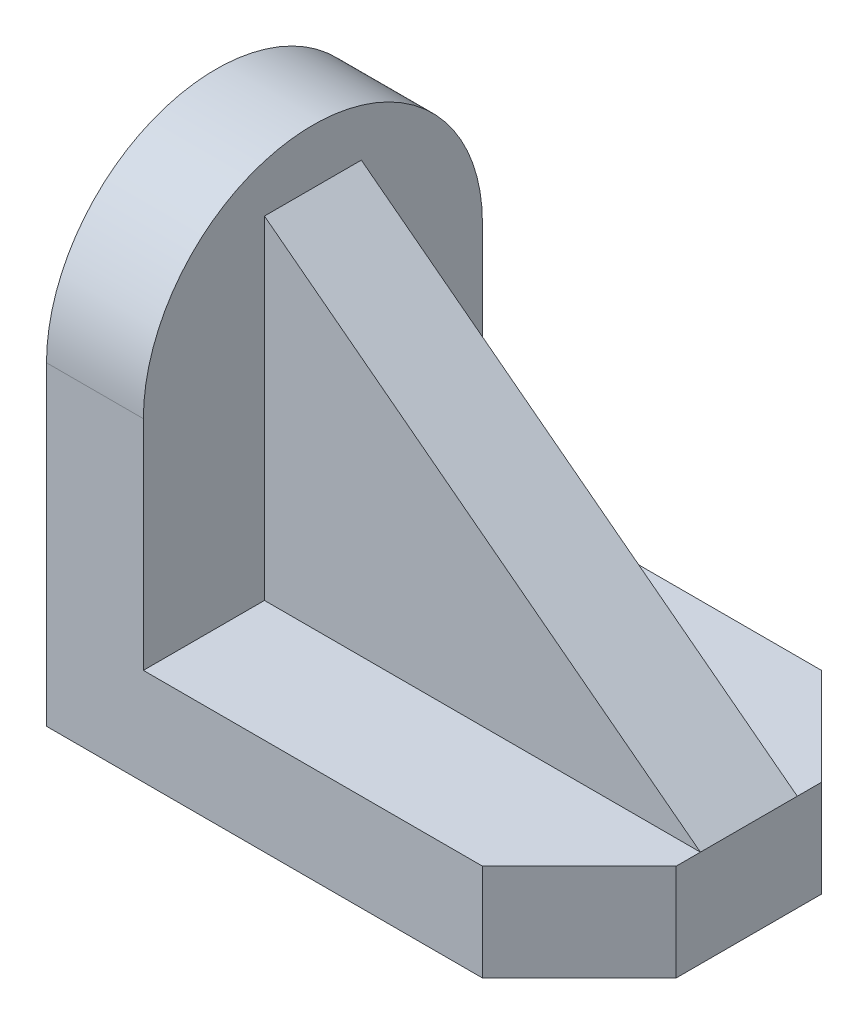
ISO-10303-21;
HEADER;
FILE_DESCRIPTION(('STEP AP214'),'2;1');
FILE_NAME('part.step','',(''),(''),'','','');
FILE_SCHEMA(('AUTOMOTIVE_DESIGN { 1 0 10303 214 1 1 1 1 }'));
ENDSEC;
DATA;
#1=APPLICATION_CONTEXT('core data for automotive mechanical design processes');
#2=APPLICATION_PROTOCOL_DEFINITION('international standard','automotive_design',2000,#1);
#3=PRODUCT_CONTEXT('',#1,'mechanical');
#4=PRODUCT('Part','Part','',(#3));
#5=PRODUCT_RELATED_PRODUCT_CATEGORY('part','',(#4));
#6=PRODUCT_DEFINITION_FORMATION('','',#4);
#7=PRODUCT_DEFINITION_CONTEXT('part definition',#1,'design');
#8=PRODUCT_DEFINITION('design','',#6,#7);
#9=PRODUCT_DEFINITION_SHAPE('','',#8);
#10=(LENGTH_UNIT() NAMED_UNIT(*) SI_UNIT(.MILLI.,.METRE.));
#11=(NAMED_UNIT(*) PLANE_ANGLE_UNIT() SI_UNIT($,.RADIAN.));
#12=(NAMED_UNIT(*) SI_UNIT($,.STERADIAN.) SOLID_ANGLE_UNIT());
#13=UNCERTAINTY_MEASURE_WITH_UNIT(LENGTH_MEASURE(1.E-05),#10,'distance_accuracy_value','');
#14=(GEOMETRIC_REPRESENTATION_CONTEXT(3) GLOBAL_UNCERTAINTY_ASSIGNED_CONTEXT((#13)) GLOBAL_UNIT_ASSIGNED_CONTEXT((#10,
#11,#12)) REPRESENTATION_CONTEXT('',''));
#15=CARTESIAN_POINT('',(0.,0.,0.));
#16=DIRECTION('',(0.,0.,1.));
#17=DIRECTION('',(1.,0.,0.));
#18=AXIS2_PLACEMENT_3D('',#15,#16,#17);
#19=CARTESIAN_POINT('',(0.,12.,0.));
#20=DIRECTION('',(0.,-1.,0.));
#21=DIRECTION('',(0.,0.,-1.));
#22=AXIS2_PLACEMENT_3D('',#19,#20,#21);
#23=PLANE('',#22);
#24=DIRECTION('',(0.,0.,-1.));
#25=VECTOR('',#24,1.);
#26=CARTESIAN_POINT('',(-21.,12.,21.));
#27=LINE('',#26,#25);
#28=CARTESIAN_POINT('',(-21.,12.,21.));
#29=VERTEX_POINT('',#28);
#30=CARTESIAN_POINT('',(-21.,12.,6.00000000000001));
#31=VERTEX_POINT('',#30);
#32=EDGE_CURVE('E146',#29,#31,#27,.T.);
#33=ORIENTED_EDGE('',*,*,#32,.F.);
#34=DIRECTION('',(1.,0.,0.));
#35=VECTOR('',#34,1.);
#36=CARTESIAN_POINT('',(33.,12.,21.));
#37=LINE('',#36,#35);
#38=CARTESIAN_POINT('',(21.,12.,21.));
#39=VERTEX_POINT('',#38);
#40=EDGE_CURVE('E186',#29,#39,#37,.T.);
#41=ORIENTED_EDGE('',*,*,#40,.T.);
#42=DIRECTION('',(-0.707106781186547,0.,0.707106781186548));
#43=VECTOR('',#42,1.);
#44=CARTESIAN_POINT('',(33.,12.,8.99999999999999));
#45=LINE('',#44,#43);
#46=CARTESIAN_POINT('',(33.,12.,8.99999999999999));
#47=VERTEX_POINT('',#46);
#48=EDGE_CURVE('E228',#39,#47,#45,.F.);
#49=ORIENTED_EDGE('',*,*,#48,.T.);
#50=DIRECTION('',(0.,0.,-1.));
#51=VECTOR('',#50,1.);
#52=CARTESIAN_POINT('',(33.,12.,-21.));
#53=LINE('',#52,#51);
#54=CARTESIAN_POINT('',(33.,12.,6.));
#55=VERTEX_POINT('',#54);
#56=EDGE_CURVE('E191',#47,#55,#53,.T.);
#57=ORIENTED_EDGE('',*,*,#56,.T.);
#58=DIRECTION('',(1.,0.,0.));
#59=VECTOR('',#58,1.);
#60=CARTESIAN_POINT('',(0.,12.,6.));
#61=LINE('',#60,#59);
#62=EDGE_CURVE('E177',#31,#55,#61,.T.);
#63=ORIENTED_EDGE('',*,*,#62,.F.);
#64=EDGE_LOOP('',(#33,#41,#49,#57,#63));
#65=FACE_BOUND('',#64,.T.);
#66=ADVANCED_FACE('F49',(#65),#23,.F.);
#67=CARTESIAN_POINT('',(-21.,12.,-6.));
#68=VERTEX_POINT('',#67);
#69=CARTESIAN_POINT('',(-21.,12.,-21.));
#70=VERTEX_POINT('',#69);
#71=EDGE_CURVE('E154',#68,#70,#27,.T.);
#72=ORIENTED_EDGE('',*,*,#71,.F.);
#73=DIRECTION('',(1.,0.,0.));
#74=VECTOR('',#73,1.);
#75=CARTESIAN_POINT('',(0.,12.,-6.00000000000001));
#76=LINE('',#75,#74);
#77=CARTESIAN_POINT('',(33.,12.,-6.00000000000001));
#78=VERTEX_POINT('',#77);
#79=EDGE_CURVE('E156',#68,#78,#76,.T.);
#80=ORIENTED_EDGE('',*,*,#79,.T.);
#81=CARTESIAN_POINT('',(33.,12.,-9.00000000000001));
#82=VERTEX_POINT('',#81);
#83=EDGE_CURVE('E189',#78,#82,#53,.T.);
#84=ORIENTED_EDGE('',*,*,#83,.T.);
#85=DIRECTION('',(0.707106781186548,0.,0.707106781186547));
#86=VECTOR('',#85,1.);
#87=CARTESIAN_POINT('',(21.,12.,-21.));
#88=LINE('',#87,#86);
#89=CARTESIAN_POINT('',(21.,12.,-21.));
#90=VERTEX_POINT('',#89);
#91=EDGE_CURVE('E242',#82,#90,#88,.F.);
#92=ORIENTED_EDGE('',*,*,#91,.T.);
#93=DIRECTION('',(-1.,0.,0.));
#94=VECTOR('',#93,1.);
#95=CARTESIAN_POINT('',(33.,12.,-21.));
#96=LINE('',#95,#94);
#97=EDGE_CURVE('E195',#90,#70,#96,.T.);
#98=ORIENTED_EDGE('',*,*,#97,.T.);
#99=EDGE_LOOP('',(#72,#80,#84,#92,#98));
#100=FACE_BOUND('',#99,.T.);
#101=ADVANCED_FACE('F281',(#100),#23,.F.);
#102=CARTESIAN_POINT('',(-33.,12.,-21.));
#103=DIRECTION('',(1.,0.,0.));
#104=DIRECTION('',(0.,0.,-1.));
#105=AXIS2_PLACEMENT_3D('',#102,#103,#104);
#106=PLANE('',#105);
#107=DIRECTION('',(0.,-1.,0.));
#108=VECTOR('',#107,1.);
#109=CARTESIAN_POINT('',(-33.,12.,21.));
#110=LINE('',#109,#108);
#111=CARTESIAN_POINT('',(-33.,39.,21.));
#112=VERTEX_POINT('',#111);
#113=CARTESIAN_POINT('',(-33.,0.,21.));
#114=VERTEX_POINT('',#113);
#115=EDGE_CURVE('E213',#112,#114,#110,.T.);
#116=ORIENTED_EDGE('',*,*,#115,.F.);
#117=CARTESIAN_POINT('',(-33.,39.,0.));
#118=DIRECTION('',(-1.,0.,0.));
#119=DIRECTION('',(0.,0.,1.));
#120=AXIS2_PLACEMENT_3D('',#117,#118,#119);
#121=CIRCLE('',#120,21.);
#122=CARTESIAN_POINT('',(-33.,39.,-21.));
#123=VERTEX_POINT('',#122);
#124=EDGE_CURVE('E163',#112,#123,#121,.T.);
#125=ORIENTED_EDGE('',*,*,#124,.T.);
#126=DIRECTION('',(0.,-1.,0.));
#127=VECTOR('',#126,1.);
#128=CARTESIAN_POINT('',(-33.,12.,-21.));
#129=LINE('',#128,#127);
#130=CARTESIAN_POINT('',(-33.,0.,-21.));
#131=VERTEX_POINT('',#130);
#132=EDGE_CURVE('E139',#123,#131,#129,.T.);
#133=ORIENTED_EDGE('',*,*,#132,.T.);
#134=DIRECTION('',(0.,0.,1.));
#135=VECTOR('',#134,1.);
#136=CARTESIAN_POINT('',(-33.,0.,-21.));
#137=LINE('',#136,#135);
#138=EDGE_CURVE('E185',#131,#114,#137,.T.);
#139=ORIENTED_EDGE('',*,*,#138,.T.);
#140=EDGE_LOOP('',(#116,#125,#133,#139));
#141=FACE_BOUND('',#140,.T.);
#142=ADVANCED_FACE('F288',(#141),#106,.F.);
#143=CARTESIAN_POINT('',(33.,12.,21.));
#144=DIRECTION('',(0.,0.,-1.));
#145=DIRECTION('',(-1.,0.,0.));
#146=AXIS2_PLACEMENT_3D('',#143,#144,#145);
#147=PLANE('',#146);
#148=DIRECTION('',(1.,0.,0.));
#149=VECTOR('',#148,1.);
#150=CARTESIAN_POINT('',(33.,0.,21.));
#151=LINE('',#150,#149);
#152=CARTESIAN_POINT('',(21.,0.,21.));
#153=VERTEX_POINT('',#152);
#154=EDGE_CURVE('E201',#114,#153,#151,.T.);
#155=ORIENTED_EDGE('',*,*,#154,.T.);
#156=DIRECTION('',(0.,1.,0.));
#157=VECTOR('',#156,1.);
#158=CARTESIAN_POINT('',(21.,12.,21.));
#159=LINE('',#158,#157);
#160=EDGE_CURVE('E224',#153,#39,#159,.T.);
#161=ORIENTED_EDGE('',*,*,#160,.T.);
#162=ORIENTED_EDGE('',*,*,#40,.F.);
#163=DIRECTION('',(0.,-1.,0.));
#164=VECTOR('',#163,1.);
#165=CARTESIAN_POINT('',(-21.,39.,21.));
#166=LINE('',#165,#164);
#167=CARTESIAN_POINT('',(-21.,39.,21.));
#168=VERTEX_POINT('',#167);
#169=EDGE_CURVE('E157',#168,#29,#166,.T.);
#170=ORIENTED_EDGE('',*,*,#169,.F.);
#171=DIRECTION('',(1.,0.,0.));
#172=VECTOR('',#171,1.);
#173=CARTESIAN_POINT('',(-21.,39.,21.));
#174=LINE('',#173,#172);
#175=EDGE_CURVE('E145',#112,#168,#174,.T.);
#176=ORIENTED_EDGE('',*,*,#175,.F.);
#177=ORIENTED_EDGE('',*,*,#115,.T.);
#178=EDGE_LOOP('',(#155,#161,#162,#170,#176,#177));
#179=FACE_BOUND('',#178,.T.);
#180=ADVANCED_FACE('F286',(#179),#147,.F.);
#181=CARTESIAN_POINT('',(33.,12.,-21.));
#182=DIRECTION('',(-1.,0.,0.));
#183=DIRECTION('',(0.,0.,1.));
#184=AXIS2_PLACEMENT_3D('',#181,#182,#183);
#185=PLANE('',#184);
#186=ORIENTED_EDGE('',*,*,#83,.F.);
#187=DIRECTION('',(0.,0.,1.));
#188=VECTOR('',#187,1.);
#189=CARTESIAN_POINT('',(33.,12.,6.));
#190=LINE('',#189,#188);
#191=EDGE_CURVE('E59',#78,#55,#190,.T.);
#192=ORIENTED_EDGE('',*,*,#191,.T.);
#193=ORIENTED_EDGE('',*,*,#56,.F.);
#194=DIRECTION('',(0.,-1.,0.));
#195=VECTOR('',#194,1.);
#196=CARTESIAN_POINT('',(33.,12.,9.));
#197=LINE('',#196,#195);
#198=CARTESIAN_POINT('',(33.,0.,8.99999999999999));
#199=VERTEX_POINT('',#198);
#200=EDGE_CURVE('E217',#47,#199,#197,.T.);
#201=ORIENTED_EDGE('',*,*,#200,.T.);
#202=DIRECTION('',(0.,0.,-1.));
#203=VECTOR('',#202,1.);
#204=CARTESIAN_POINT('',(33.,0.,-21.));
#205=LINE('',#204,#203);
#206=CARTESIAN_POINT('',(33.,0.,-9.00000000000001));
#207=VERTEX_POINT('',#206);
#208=EDGE_CURVE('E205',#199,#207,#205,.T.);
#209=ORIENTED_EDGE('',*,*,#208,.T.);
#210=DIRECTION('',(0.,1.,0.));
#211=VECTOR('',#210,1.);
#212=CARTESIAN_POINT('',(33.,12.,-9.00000000000001));
#213=LINE('',#212,#211);
#214=EDGE_CURVE('E238',#207,#82,#213,.T.);
#215=ORIENTED_EDGE('',*,*,#214,.T.);
#216=EDGE_LOOP('',(#186,#192,#193,#201,#209,#215));
#217=FACE_BOUND('',#216,.T.);
#218=ADVANCED_FACE('F257',(#217),#185,.F.);
#219=CARTESIAN_POINT('',(33.,12.,-21.));
#220=DIRECTION('',(0.,0.,1.));
#221=DIRECTION('',(1.,0.,0.));
#222=AXIS2_PLACEMENT_3D('',#219,#220,#221);
#223=PLANE('',#222);
#224=ORIENTED_EDGE('',*,*,#97,.F.);
#225=DIRECTION('',(0.,-1.,0.));
#226=VECTOR('',#225,1.);
#227=CARTESIAN_POINT('',(21.,12.,-21.));
#228=LINE('',#227,#226);
#229=CARTESIAN_POINT('',(21.,0.,-21.));
#230=VERTEX_POINT('',#229);
#231=EDGE_CURVE('E231',#90,#230,#228,.T.);
#232=ORIENTED_EDGE('',*,*,#231,.T.);
#233=DIRECTION('',(-1.,0.,0.));
#234=VECTOR('',#233,1.);
#235=CARTESIAN_POINT('',(33.,0.,-21.));
#236=LINE('',#235,#234);
#237=EDGE_CURVE('E190',#230,#131,#236,.T.);
#238=ORIENTED_EDGE('',*,*,#237,.T.);
#239=ORIENTED_EDGE('',*,*,#132,.F.);
#240=DIRECTION('',(-1.,0.,0.));
#241=VECTOR('',#240,1.);
#242=CARTESIAN_POINT('',(-21.,39.,-21.));
#243=LINE('',#242,#241);
#244=CARTESIAN_POINT('',(-21.,39.,-21.));
#245=VERTEX_POINT('',#244);
#246=EDGE_CURVE('E132',#245,#123,#243,.T.);
#247=ORIENTED_EDGE('',*,*,#246,.F.);
#248=DIRECTION('',(0.,-1.,0.));
#249=VECTOR('',#248,1.);
#250=CARTESIAN_POINT('',(-21.,39.,-21.));
#251=LINE('',#250,#249);
#252=EDGE_CURVE('E136',#245,#70,#251,.T.);
#253=ORIENTED_EDGE('',*,*,#252,.T.);
#254=EDGE_LOOP('',(#224,#232,#238,#239,#247,#253));
#255=FACE_BOUND('',#254,.T.);
#256=ADVANCED_FACE('F135',(#255),#223,.F.);
#257=CARTESIAN_POINT('',(0.,0.,0.));
#258=DIRECTION('',(0.,-1.,0.));
#259=DIRECTION('',(0.,0.,-1.));
#260=AXIS2_PLACEMENT_3D('',#257,#258,#259);
#261=PLANE('',#260);
#262=ORIENTED_EDGE('',*,*,#237,.F.);
#263=DIRECTION('',(-0.707106781186548,0.,-0.707106781186547));
#264=VECTOR('',#263,1.);
#265=CARTESIAN_POINT('',(21.,0.,-21.));
#266=LINE('',#265,#264);
#267=EDGE_CURVE('E235',#230,#207,#266,.F.);
#268=ORIENTED_EDGE('',*,*,#267,.T.);
#269=ORIENTED_EDGE('',*,*,#208,.F.);
#270=DIRECTION('',(0.707106781186547,0.,-0.707106781186548));
#271=VECTOR('',#270,1.);
#272=CARTESIAN_POINT('',(21.,0.,21.));
#273=LINE('',#272,#271);
#274=EDGE_CURVE('E221',#199,#153,#273,.F.);
#275=ORIENTED_EDGE('',*,*,#274,.T.);
#276=ORIENTED_EDGE('',*,*,#154,.F.);
#277=ORIENTED_EDGE('',*,*,#138,.F.);
#278=EDGE_LOOP('',(#262,#268,#269,#275,#276,#277));
#279=FACE_BOUND('',#278,.T.);
#280=ADVANCED_FACE('F274',(#279),#261,.T.);
#281=CARTESIAN_POINT('',(33.,12.,8.99999999999999));
#282=DIRECTION('',(-0.707106781186548,0.,-0.707106781186547));
#283=DIRECTION('',(0.,-1.,0.));
#284=AXIS2_PLACEMENT_3D('',#281,#282,#283);
#285=PLANE('',#284);
#286=ORIENTED_EDGE('',*,*,#48,.F.);
#287=ORIENTED_EDGE('',*,*,#160,.F.);
#288=ORIENTED_EDGE('',*,*,#274,.F.);
#289=ORIENTED_EDGE('',*,*,#200,.F.);
#290=EDGE_LOOP('',(#286,#287,#288,#289));
#291=FACE_BOUND('',#290,.T.);
#292=ADVANCED_FACE('F269',(#291),#285,.F.);
#293=CARTESIAN_POINT('',(21.,12.,-21.));
#294=DIRECTION('',(-0.707106781186547,0.,0.707106781186548));
#295=DIRECTION('',(0.,-1.,0.));
#296=AXIS2_PLACEMENT_3D('',#293,#294,#295);
#297=PLANE('',#296);
#298=ORIENTED_EDGE('',*,*,#91,.F.);
#299=ORIENTED_EDGE('',*,*,#214,.F.);
#300=ORIENTED_EDGE('',*,*,#267,.F.);
#301=ORIENTED_EDGE('',*,*,#231,.F.);
#302=EDGE_LOOP('',(#298,#299,#300,#301));
#303=FACE_BOUND('',#302,.T.);
#304=ADVANCED_FACE('F279',(#303),#297,.F.);
#305=CARTESIAN_POINT('',(0.,54.,-6.00000000000001));
#306=DIRECTION('',(0.,0.,-1.));
#307=DIRECTION('',(-1.,0.,0.));
#308=AXIS2_PLACEMENT_3D('',#305,#306,#307);
#309=PLANE('',#308);
#310=DIRECTION('',(0.,-1.,0.));
#311=VECTOR('',#310,1.);
#312=CARTESIAN_POINT('',(-21.,54.,-6.00000000000001));
#313=LINE('',#312,#311);
#314=CARTESIAN_POINT('',(-21.,53.2363636363634,-6.00000000000001));
#315=VERTEX_POINT('',#314);
#316=EDGE_CURVE('E66',#315,#68,#313,.T.);
#317=ORIENTED_EDGE('',*,*,#316,.F.);
#318=DIRECTION('',(0.794767813926732,-0.606913603362228,0.));
#319=VECTOR('',#318,1.);
#320=CARTESIAN_POINT('',(-8.10357068281484,43.3881812486948,-6.00000000000001));
#321=LINE('',#320,#319);
#322=EDGE_CURVE('E249',#315,#78,#321,.T.);
#323=ORIENTED_EDGE('',*,*,#322,.T.);
#324=ORIENTED_EDGE('',*,*,#79,.F.);
#325=EDGE_LOOP('',(#317,#323,#324));
#326=FACE_BOUND('',#325,.T.);
#327=ADVANCED_FACE('F284',(#326),#309,.T.);
#328=CARTESIAN_POINT('',(0.,54.,6.));
#329=DIRECTION('',(0.,0.,-1.));
#330=DIRECTION('',(-1.,0.,0.));
#331=AXIS2_PLACEMENT_3D('',#328,#329,#330);
#332=PLANE('',#331);
#333=ORIENTED_EDGE('',*,*,#62,.T.);
#334=DIRECTION('',(-0.794767813926732,0.606913603362228,0.));
#335=VECTOR('',#334,1.);
#336=CARTESIAN_POINT('',(-22.0000000000003,54.,6.00000000000001));
#337=LINE('',#336,#335);
#338=CARTESIAN_POINT('',(-21.,53.2363636363634,6.00000000000001));
#339=VERTEX_POINT('',#338);
#340=EDGE_CURVE('E13',#55,#339,#337,.T.);
#341=ORIENTED_EDGE('',*,*,#340,.T.);
#342=DIRECTION('',(0.,-1.,0.));
#343=VECTOR('',#342,1.);
#344=CARTESIAN_POINT('',(-21.,54.,6.00000000000001));
#345=LINE('',#344,#343);
#346=EDGE_CURVE('E180',#339,#31,#345,.T.);
#347=ORIENTED_EDGE('',*,*,#346,.T.);
#348=EDGE_LOOP('',(#333,#341,#347));
#349=FACE_BOUND('',#348,.T.);
#350=ADVANCED_FACE('F261',(#349),#332,.F.);
#351=CARTESIAN_POINT('',(-22.0000000000003,54.,0.));
#352=DIRECTION('',(0.606913603362228,0.794767813926732,0.));
#353=DIRECTION('',(0.,0.,1.));
#354=AXIS2_PLACEMENT_3D('',#351,#352,#353);
#355=PLANE('',#354);
#356=ORIENTED_EDGE('',*,*,#340,.F.);
#357=ORIENTED_EDGE('',*,*,#191,.F.);
#358=ORIENTED_EDGE('',*,*,#322,.F.);
#359=DIRECTION('',(0.,0.,-1.));
#360=VECTOR('',#359,1.);
#361=CARTESIAN_POINT('',(-21.,53.2363636363634,0.));
#362=LINE('',#361,#360);
#363=EDGE_CURVE('E245',#339,#315,#362,.T.);
#364=ORIENTED_EDGE('',*,*,#363,.F.);
#365=EDGE_LOOP('',(#356,#357,#358,#364));
#366=FACE_BOUND('',#365,.T.);
#367=ADVANCED_FACE('F52',(#366),#355,.T.);
#368=CARTESIAN_POINT('',(-21.,39.,21.));
#369=DIRECTION('',(-1.,0.,0.));
#370=DIRECTION('',(0.,0.,1.));
#371=AXIS2_PLACEMENT_3D('',#368,#369,#370);
#372=PLANE('',#371);
#373=ORIENTED_EDGE('',*,*,#32,.T.);
#374=ORIENTED_EDGE('',*,*,#346,.F.);
#375=ORIENTED_EDGE('',*,*,#363,.T.);
#376=ORIENTED_EDGE('',*,*,#316,.T.);
#377=ORIENTED_EDGE('',*,*,#71,.T.);
#378=ORIENTED_EDGE('',*,*,#252,.F.);
#379=CARTESIAN_POINT('',(-21.,39.,0.));
#380=DIRECTION('',(-1.,0.,0.));
#381=DIRECTION('',(0.,0.,1.));
#382=AXIS2_PLACEMENT_3D('',#379,#380,#381);
#383=CIRCLE('',#382,21.);
#384=EDGE_CURVE('E152',#168,#245,#383,.T.);
#385=ORIENTED_EDGE('',*,*,#384,.F.);
#386=ORIENTED_EDGE('',*,*,#169,.T.);
#387=EDGE_LOOP('',(#373,#374,#375,#376,#377,#378,#385,#386));
#388=FACE_BOUND('',#387,.T.);
#389=ADVANCED_FACE('F151',(#388),#372,.F.);
#390=CARTESIAN_POINT('',(0.,39.,0.));
#391=DIRECTION('',(-1.,0.,0.));
#392=DIRECTION('',(0.,0.,1.));
#393=AXIS2_PLACEMENT_3D('',#390,#391,#392);
#394=CYLINDRICAL_SURFACE('',#393,21.);
#395=ORIENTED_EDGE('',*,*,#175,.T.);
#396=ORIENTED_EDGE('',*,*,#384,.T.);
#397=ORIENTED_EDGE('',*,*,#246,.T.);
#398=ORIENTED_EDGE('',*,*,#124,.F.);
#399=EDGE_LOOP('',(#395,#396,#397,#398));
#400=FACE_BOUND('',#399,.T.);
#401=ADVANCED_FACE('F160',(#400),#394,.T.);
#402=CLOSED_SHELL('',(#66,#101,#142,#180,#218,#256,#280,#292,#304,#327,#350,#367,#389,#401));
#403=MANIFOLD_SOLID_BREP('B2',#402);
#404=ADVANCED_BREP_SHAPE_REPRESENTATION('',(#18,#403),#14);
#405=SHAPE_DEFINITION_REPRESENTATION(#9,#404);
ENDSEC;
END-ISO-10303-21;
